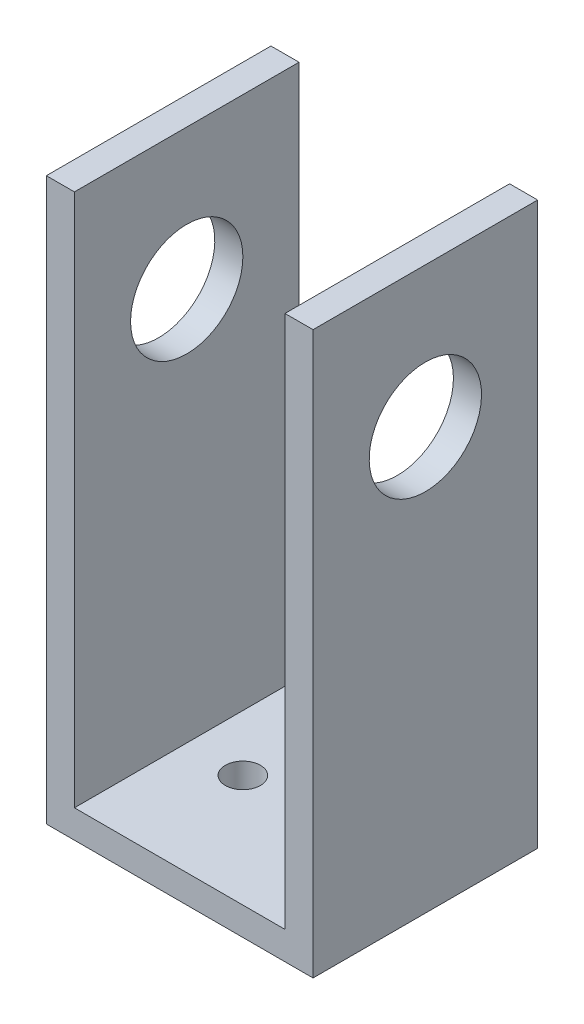
ISO-10303-21;
HEADER;
FILE_DESCRIPTION(('STEP AP214'),'2;1');
FILE_NAME('part.step','',(''),(''),'','','');
FILE_SCHEMA(('AUTOMOTIVE_DESIGN { 1 0 10303 214 1 1 1 1 }'));
ENDSEC;
DATA;
#1=APPLICATION_CONTEXT('core data for automotive mechanical design processes');
#2=APPLICATION_PROTOCOL_DEFINITION('international standard','automotive_design',2000,#1);
#3=PRODUCT_CONTEXT('',#1,'mechanical');
#4=PRODUCT('Part','Part','',(#3));
#5=PRODUCT_RELATED_PRODUCT_CATEGORY('part','',(#4));
#6=PRODUCT_DEFINITION_FORMATION('','',#4);
#7=PRODUCT_DEFINITION_CONTEXT('part definition',#1,'design');
#8=PRODUCT_DEFINITION('design','',#6,#7);
#9=PRODUCT_DEFINITION_SHAPE('','',#8);
#10=(LENGTH_UNIT() NAMED_UNIT(*) SI_UNIT(.MILLI.,.METRE.));
#11=(NAMED_UNIT(*) PLANE_ANGLE_UNIT() SI_UNIT($,.RADIAN.));
#12=(NAMED_UNIT(*) SI_UNIT($,.STERADIAN.) SOLID_ANGLE_UNIT());
#13=UNCERTAINTY_MEASURE_WITH_UNIT(LENGTH_MEASURE(1.E-05),#10,'distance_accuracy_value','');
#14=(GEOMETRIC_REPRESENTATION_CONTEXT(3) GLOBAL_UNCERTAINTY_ASSIGNED_CONTEXT((#13)) GLOBAL_UNIT_ASSIGNED_CONTEXT((#10,
#11,#12)) REPRESENTATION_CONTEXT('',''));
#15=CARTESIAN_POINT('',(0.,0.,0.));
#16=DIRECTION('',(0.,0.,1.));
#17=DIRECTION('',(1.,0.,0.));
#18=AXIS2_PLACEMENT_3D('',#15,#16,#17);
#19=CARTESIAN_POINT('',(0.,40.,40.));
#20=DIRECTION('',(1.,0.,0.));
#21=DIRECTION('',(0.,1.,0.));
#22=AXIS2_PLACEMENT_3D('',#19,#20,#21);
#23=PLANE('',#22);
#24=CARTESIAN_POINT('',(0.,30.,32.));
#25=DIRECTION('',(1.,0.,0.));
#26=DIRECTION('',(0.,1.,0.));
#27=AXIS2_PLACEMENT_3D('',#24,#25,#26);
#28=CIRCLE('',#27,4.);
#29=CARTESIAN_POINT('',(0.,34.,32.));
#30=VERTEX_POINT('',#29);
#31=EDGE_CURVE('E129',#30,#30,#28,.T.);
#32=ORIENTED_EDGE('',*,*,#31,.T.);
#33=EDGE_LOOP('',(#32));
#34=FACE_BOUND('',#33,.T.);
#35=DIRECTION('',(0.,0.,-1.));
#36=VECTOR('',#35,1.);
#37=CARTESIAN_POINT('',(0.,40.,40.));
#38=LINE('',#37,#36);
#39=CARTESIAN_POINT('',(0.,40.,40.));
#40=VERTEX_POINT('',#39);
#41=CARTESIAN_POINT('',(0.,40.,24.));
#42=VERTEX_POINT('',#41);
#43=EDGE_CURVE('E175',#40,#42,#38,.T.);
#44=ORIENTED_EDGE('',*,*,#43,.T.);
#45=DIRECTION('',(0.,1.,0.));
#46=VECTOR('',#45,1.);
#47=CARTESIAN_POINT('',(0.,40.,24.));
#48=LINE('',#47,#46);
#49=CARTESIAN_POINT('',(0.,0.,24.));
#50=VERTEX_POINT('',#49);
#51=EDGE_CURVE('E51',#50,#42,#48,.T.);
#52=ORIENTED_EDGE('',*,*,#51,.F.);
#53=DIRECTION('',(0.,0.,-1.));
#54=VECTOR('',#53,1.);
#55=CARTESIAN_POINT('',(0.,0.,40.));
#56=LINE('',#55,#54);
#57=CARTESIAN_POINT('',(0.,0.,40.));
#58=VERTEX_POINT('',#57);
#59=EDGE_CURVE('E11',#58,#50,#56,.T.);
#60=ORIENTED_EDGE('',*,*,#59,.F.);
#61=DIRECTION('',(0.,-1.,0.));
#62=VECTOR('',#61,1.);
#63=CARTESIAN_POINT('',(0.,40.,40.));
#64=LINE('',#63,#62);
#65=EDGE_CURVE('E161',#40,#58,#64,.T.);
#66=ORIENTED_EDGE('',*,*,#65,.F.);
#67=EDGE_LOOP('',(#44,#52,#60,#66));
#68=FACE_BOUND('',#67,.T.);
#69=ADVANCED_FACE('F35',(#34,#68),#23,.F.);
#70=CARTESIAN_POINT('',(19.,0.,40.));
#71=DIRECTION('',(0.,1.,0.));
#72=DIRECTION('',(-1.,0.,0.));
#73=AXIS2_PLACEMENT_3D('',#70,#71,#72);
#74=PLANE('',#73);
#75=CARTESIAN_POINT('',(6.,0.,32.));
#76=DIRECTION('',(0.,-1.,0.));
#77=DIRECTION('',(-1.,0.,0.));
#78=AXIS2_PLACEMENT_3D('',#75,#76,#77);
#79=CIRCLE('',#78,1.25);
#80=CARTESIAN_POINT('',(4.75,0.,32.));
#81=VERTEX_POINT('',#80);
#82=EDGE_CURVE('E141',#81,#81,#79,.T.);
#83=ORIENTED_EDGE('',*,*,#82,.F.);
#84=EDGE_LOOP('',(#83));
#85=FACE_BOUND('',#84,.T.);
#86=CARTESIAN_POINT('',(13.,0.,32.));
#87=DIRECTION('',(0.,-1.,0.));
#88=DIRECTION('',(1.,0.,0.));
#89=AXIS2_PLACEMENT_3D('',#86,#87,#88);
#90=CIRCLE('',#89,1.25);
#91=CARTESIAN_POINT('',(14.25,0.,32.));
#92=VERTEX_POINT('',#91);
#93=EDGE_CURVE('E132',#92,#92,#90,.T.);
#94=ORIENTED_EDGE('',*,*,#93,.F.);
#95=EDGE_LOOP('',(#94));
#96=FACE_BOUND('',#95,.T.);
#97=ORIENTED_EDGE('',*,*,#59,.T.);
#98=DIRECTION('',(-1.,0.,0.));
#99=VECTOR('',#98,1.);
#100=CARTESIAN_POINT('',(19.,0.,24.));
#101=LINE('',#100,#99);
#102=CARTESIAN_POINT('',(19.,0.,24.));
#103=VERTEX_POINT('',#102);
#104=EDGE_CURVE('E103',#103,#50,#101,.T.);
#105=ORIENTED_EDGE('',*,*,#104,.F.);
#106=DIRECTION('',(0.,0.,-1.));
#107=VECTOR('',#106,1.);
#108=CARTESIAN_POINT('',(19.,0.,40.));
#109=LINE('',#108,#107);
#110=CARTESIAN_POINT('',(19.,0.,40.));
#111=VERTEX_POINT('',#110);
#112=EDGE_CURVE('E43',#111,#103,#109,.T.);
#113=ORIENTED_EDGE('',*,*,#112,.F.);
#114=DIRECTION('',(1.,0.,0.));
#115=VECTOR('',#114,1.);
#116=CARTESIAN_POINT('',(0.,0.,40.));
#117=LINE('',#116,#115);
#118=EDGE_CURVE('E163',#58,#111,#117,.T.);
#119=ORIENTED_EDGE('',*,*,#118,.F.);
#120=EDGE_LOOP('',(#97,#105,#113,#119));
#121=FACE_BOUND('',#120,.T.);
#122=ADVANCED_FACE('F113',(#85,#96,#121),#74,.F.);
#123=CARTESIAN_POINT('',(19.,40.,40.));
#124=DIRECTION('',(-1.,0.,0.));
#125=DIRECTION('',(0.,-1.,0.));
#126=AXIS2_PLACEMENT_3D('',#123,#124,#125);
#127=PLANE('',#126);
#128=CARTESIAN_POINT('',(19.,30.,32.));
#129=DIRECTION('',(1.,0.,0.));
#130=DIRECTION('',(0.,1.,0.));
#131=AXIS2_PLACEMENT_3D('',#128,#129,#130);
#132=CIRCLE('',#131,4.);
#133=CARTESIAN_POINT('',(19.,34.,32.));
#134=VERTEX_POINT('',#133);
#135=EDGE_CURVE('E154',#134,#134,#132,.T.);
#136=ORIENTED_EDGE('',*,*,#135,.F.);
#137=EDGE_LOOP('',(#136));
#138=FACE_BOUND('',#137,.T.);
#139=ORIENTED_EDGE('',*,*,#112,.T.);
#140=DIRECTION('',(0.,1.,0.));
#141=VECTOR('',#140,1.);
#142=CARTESIAN_POINT('',(19.,40.,24.));
#143=LINE('',#142,#141);
#144=CARTESIAN_POINT('',(19.,40.,24.));
#145=VERTEX_POINT('',#144);
#146=EDGE_CURVE('E100',#103,#145,#143,.T.);
#147=ORIENTED_EDGE('',*,*,#146,.T.);
#148=DIRECTION('',(0.,0.,-1.));
#149=VECTOR('',#148,1.);
#150=CARTESIAN_POINT('',(19.,40.,40.));
#151=LINE('',#150,#149);
#152=CARTESIAN_POINT('',(19.,40.,40.));
#153=VERTEX_POINT('',#152);
#154=EDGE_CURVE('E120',#153,#145,#151,.T.);
#155=ORIENTED_EDGE('',*,*,#154,.F.);
#156=DIRECTION('',(0.,1.,0.));
#157=VECTOR('',#156,1.);
#158=CARTESIAN_POINT('',(19.,40.,40.));
#159=LINE('',#158,#157);
#160=EDGE_CURVE('E119',#111,#153,#159,.T.);
#161=ORIENTED_EDGE('',*,*,#160,.F.);
#162=EDGE_LOOP('',(#139,#147,#155,#161));
#163=FACE_BOUND('',#162,.T.);
#164=ADVANCED_FACE('F118',(#138,#163),#127,.F.);
#165=CARTESIAN_POINT('',(17.,40.,40.));
#166=DIRECTION('',(0.,-1.,0.));
#167=DIRECTION('',(0.,0.,-1.));
#168=AXIS2_PLACEMENT_3D('',#165,#166,#167);
#169=PLANE('',#168);
#170=ORIENTED_EDGE('',*,*,#154,.T.);
#171=DIRECTION('',(-1.,0.,0.));
#172=VECTOR('',#171,1.);
#173=CARTESIAN_POINT('',(19.,40.,24.));
#174=LINE('',#173,#172);
#175=CARTESIAN_POINT('',(17.,40.,24.));
#176=VERTEX_POINT('',#175);
#177=EDGE_CURVE('E105',#145,#176,#174,.T.);
#178=ORIENTED_EDGE('',*,*,#177,.T.);
#179=DIRECTION('',(0.,0.,-1.));
#180=VECTOR('',#179,1.);
#181=CARTESIAN_POINT('',(17.,40.,40.));
#182=LINE('',#181,#180);
#183=CARTESIAN_POINT('',(17.,40.,40.));
#184=VERTEX_POINT('',#183);
#185=EDGE_CURVE('E122',#184,#176,#182,.T.);
#186=ORIENTED_EDGE('',*,*,#185,.F.);
#187=DIRECTION('',(-1.,0.,0.));
#188=VECTOR('',#187,1.);
#189=CARTESIAN_POINT('',(17.,40.,40.));
#190=LINE('',#189,#188);
#191=EDGE_CURVE('E166',#153,#184,#190,.T.);
#192=ORIENTED_EDGE('',*,*,#191,.F.);
#193=EDGE_LOOP('',(#170,#178,#186,#192));
#194=FACE_BOUND('',#193,.T.);
#195=ADVANCED_FACE('F194',(#194),#169,.F.);
#196=CARTESIAN_POINT('',(17.,2.,40.));
#197=DIRECTION('',(1.,0.,0.));
#198=DIRECTION('',(0.,0.,-1.));
#199=AXIS2_PLACEMENT_3D('',#196,#197,#198);
#200=PLANE('',#199);
#201=CARTESIAN_POINT('',(17.,30.,32.));
#202=DIRECTION('',(1.,0.,0.));
#203=DIRECTION('',(0.,0.,-1.));
#204=AXIS2_PLACEMENT_3D('',#201,#202,#203);
#205=CIRCLE('',#204,4.);
#206=CARTESIAN_POINT('',(17.,30.,28.));
#207=VERTEX_POINT('',#206);
#208=EDGE_CURVE('E128',#207,#207,#205,.T.);
#209=ORIENTED_EDGE('',*,*,#208,.T.);
#210=EDGE_LOOP('',(#209));
#211=FACE_BOUND('',#210,.T.);
#212=ORIENTED_EDGE('',*,*,#185,.T.);
#213=DIRECTION('',(0.,-1.,0.));
#214=VECTOR('',#213,1.);
#215=CARTESIAN_POINT('',(17.,2.,24.));
#216=LINE('',#215,#214);
#217=CARTESIAN_POINT('',(17.,2.,24.));
#218=VERTEX_POINT('',#217);
#219=EDGE_CURVE('E151',#176,#218,#216,.T.);
#220=ORIENTED_EDGE('',*,*,#219,.T.);
#221=DIRECTION('',(0.,0.,-1.));
#222=VECTOR('',#221,1.);
#223=CARTESIAN_POINT('',(17.,2.,40.));
#224=LINE('',#223,#222);
#225=CARTESIAN_POINT('',(17.,2.,40.));
#226=VERTEX_POINT('',#225);
#227=EDGE_CURVE('E184',#226,#218,#224,.T.);
#228=ORIENTED_EDGE('',*,*,#227,.F.);
#229=DIRECTION('',(0.,-1.,0.));
#230=VECTOR('',#229,1.);
#231=CARTESIAN_POINT('',(17.,2.,40.));
#232=LINE('',#231,#230);
#233=EDGE_CURVE('E168',#184,#226,#232,.T.);
#234=ORIENTED_EDGE('',*,*,#233,.F.);
#235=EDGE_LOOP('',(#212,#220,#228,#234));
#236=FACE_BOUND('',#235,.T.);
#237=ADVANCED_FACE('F190',(#211,#236),#200,.F.);
#238=CARTESIAN_POINT('',(2.,2.,40.));
#239=DIRECTION('',(0.,-1.,0.));
#240=DIRECTION('',(0.,0.,-1.));
#241=AXIS2_PLACEMENT_3D('',#238,#239,#240);
#242=PLANE('',#241);
#243=CARTESIAN_POINT('',(6.,2.,32.));
#244=DIRECTION('',(0.,-1.,0.));
#245=DIRECTION('',(0.,0.,-1.));
#246=AXIS2_PLACEMENT_3D('',#243,#244,#245);
#247=CIRCLE('',#246,1.25);
#248=CARTESIAN_POINT('',(6.,2.,30.75));
#249=VERTEX_POINT('',#248);
#250=EDGE_CURVE('E38',#249,#249,#247,.T.);
#251=ORIENTED_EDGE('',*,*,#250,.T.);
#252=EDGE_LOOP('',(#251));
#253=FACE_BOUND('',#252,.T.);
#254=CARTESIAN_POINT('',(13.,2.,32.));
#255=DIRECTION('',(0.,-1.,0.));
#256=DIRECTION('',(0.,0.,-1.));
#257=AXIS2_PLACEMENT_3D('',#254,#255,#256);
#258=CIRCLE('',#257,1.25);
#259=CARTESIAN_POINT('',(13.,2.,30.75));
#260=VERTEX_POINT('',#259);
#261=EDGE_CURVE('E130',#260,#260,#258,.T.);
#262=ORIENTED_EDGE('',*,*,#261,.T.);
#263=EDGE_LOOP('',(#262));
#264=FACE_BOUND('',#263,.T.);
#265=ORIENTED_EDGE('',*,*,#227,.T.);
#266=DIRECTION('',(-1.,0.,0.));
#267=VECTOR('',#266,1.);
#268=CARTESIAN_POINT('',(2.,2.,24.));
#269=LINE('',#268,#267);
#270=CARTESIAN_POINT('',(2.,2.,24.));
#271=VERTEX_POINT('',#270);
#272=EDGE_CURVE('E148',#218,#271,#269,.T.);
#273=ORIENTED_EDGE('',*,*,#272,.T.);
#274=DIRECTION('',(0.,0.,-1.));
#275=VECTOR('',#274,1.);
#276=CARTESIAN_POINT('',(2.,2.,40.));
#277=LINE('',#276,#275);
#278=CARTESIAN_POINT('',(2.,2.,40.));
#279=VERTEX_POINT('',#278);
#280=EDGE_CURVE('E181',#279,#271,#277,.T.);
#281=ORIENTED_EDGE('',*,*,#280,.F.);
#282=DIRECTION('',(-1.,0.,0.));
#283=VECTOR('',#282,1.);
#284=CARTESIAN_POINT('',(2.,2.,40.));
#285=LINE('',#284,#283);
#286=EDGE_CURVE('E170',#226,#279,#285,.T.);
#287=ORIENTED_EDGE('',*,*,#286,.F.);
#288=EDGE_LOOP('',(#265,#273,#281,#287));
#289=FACE_BOUND('',#288,.T.);
#290=ADVANCED_FACE('F207',(#253,#264,#289),#242,.F.);
#291=CARTESIAN_POINT('',(2.,2.,40.));
#292=DIRECTION('',(-1.,0.,0.));
#293=DIRECTION('',(0.,-1.,0.));
#294=AXIS2_PLACEMENT_3D('',#291,#292,#293);
#295=PLANE('',#294);
#296=CARTESIAN_POINT('',(2.,30.,32.));
#297=DIRECTION('',(-1.,0.,0.));
#298=DIRECTION('',(0.,-1.,0.));
#299=AXIS2_PLACEMENT_3D('',#296,#297,#298);
#300=CIRCLE('',#299,4.);
#301=CARTESIAN_POINT('',(2.,26.,32.));
#302=VERTEX_POINT('',#301);
#303=EDGE_CURVE('E126',#302,#302,#300,.T.);
#304=ORIENTED_EDGE('',*,*,#303,.T.);
#305=EDGE_LOOP('',(#304));
#306=FACE_BOUND('',#305,.T.);
#307=ORIENTED_EDGE('',*,*,#280,.T.);
#308=DIRECTION('',(0.,1.,0.));
#309=VECTOR('',#308,1.);
#310=CARTESIAN_POINT('',(2.,2.,24.));
#311=LINE('',#310,#309);
#312=CARTESIAN_POINT('',(2.00000000000001,40.,24.));
#313=VERTEX_POINT('',#312);
#314=EDGE_CURVE('E144',#271,#313,#311,.T.);
#315=ORIENTED_EDGE('',*,*,#314,.T.);
#316=DIRECTION('',(0.,0.,-1.));
#317=VECTOR('',#316,1.);
#318=CARTESIAN_POINT('',(2.,40.,40.));
#319=LINE('',#318,#317);
#320=CARTESIAN_POINT('',(2.,40.,40.));
#321=VERTEX_POINT('',#320);
#322=EDGE_CURVE('E178',#321,#313,#319,.T.);
#323=ORIENTED_EDGE('',*,*,#322,.F.);
#324=DIRECTION('',(0.,1.,0.));
#325=VECTOR('',#324,1.);
#326=CARTESIAN_POINT('',(2.,2.,40.));
#327=LINE('',#326,#325);
#328=EDGE_CURVE('E172',#279,#321,#327,.T.);
#329=ORIENTED_EDGE('',*,*,#328,.F.);
#330=EDGE_LOOP('',(#307,#315,#323,#329));
#331=FACE_BOUND('',#330,.T.);
#332=ADVANCED_FACE('F202',(#306,#331),#295,.F.);
#333=CARTESIAN_POINT('',(2.,40.,40.));
#334=DIRECTION('',(0.,-1.,0.));
#335=DIRECTION('',(0.,0.,-1.));
#336=AXIS2_PLACEMENT_3D('',#333,#334,#335);
#337=PLANE('',#336);
#338=ORIENTED_EDGE('',*,*,#322,.T.);
#339=EDGE_CURVE('E116',#313,#42,#174,.T.);
#340=ORIENTED_EDGE('',*,*,#339,.T.);
#341=ORIENTED_EDGE('',*,*,#43,.F.);
#342=DIRECTION('',(-1.,0.,0.));
#343=VECTOR('',#342,1.);
#344=CARTESIAN_POINT('',(2.,40.,40.));
#345=LINE('',#344,#343);
#346=EDGE_CURVE('E59',#321,#40,#345,.T.);
#347=ORIENTED_EDGE('',*,*,#346,.F.);
#348=EDGE_LOOP('',(#338,#340,#341,#347));
#349=FACE_BOUND('',#348,.T.);
#350=ADVANCED_FACE('F199',(#349),#337,.F.);
#351=CARTESIAN_POINT('',(0.,0.,40.));
#352=DIRECTION('',(0.,0.,1.));
#353=DIRECTION('',(1.,0.,0.));
#354=AXIS2_PLACEMENT_3D('',#351,#352,#353);
#355=PLANE('',#354);
#356=ORIENTED_EDGE('',*,*,#65,.T.);
#357=ORIENTED_EDGE('',*,*,#118,.T.);
#358=ORIENTED_EDGE('',*,*,#160,.T.);
#359=ORIENTED_EDGE('',*,*,#191,.T.);
#360=ORIENTED_EDGE('',*,*,#233,.T.);
#361=ORIENTED_EDGE('',*,*,#286,.T.);
#362=ORIENTED_EDGE('',*,*,#328,.T.);
#363=ORIENTED_EDGE('',*,*,#346,.T.);
#364=EDGE_LOOP('',(#356,#357,#358,#359,#360,#361,#362,#363));
#365=FACE_BOUND('',#364,.T.);
#366=ADVANCED_FACE('F195',(#365),#355,.T.);
#367=CARTESIAN_POINT('',(0.,30.,32.));
#368=DIRECTION('',(1.,0.,0.));
#369=DIRECTION('',(0.,1.,0.));
#370=AXIS2_PLACEMENT_3D('',#367,#368,#369);
#371=CYLINDRICAL_SURFACE('',#370,4.);
#372=ORIENTED_EDGE('',*,*,#31,.F.);
#373=EDGE_LOOP('',(#372));
#374=FACE_BOUND('',#373,.T.);
#375=ORIENTED_EDGE('',*,*,#303,.F.);
#376=EDGE_LOOP('',(#375));
#377=FACE_BOUND('',#376,.T.);
#378=ADVANCED_FACE('F227',(#374,#377),#371,.F.);
#379=ORIENTED_EDGE('',*,*,#135,.T.);
#380=EDGE_LOOP('',(#379));
#381=FACE_BOUND('',#380,.T.);
#382=ORIENTED_EDGE('',*,*,#208,.F.);
#383=EDGE_LOOP('',(#382));
#384=FACE_BOUND('',#383,.T.);
#385=ADVANCED_FACE('F230',(#381,#384),#371,.F.);
#386=CARTESIAN_POINT('',(19.,40.,24.));
#387=DIRECTION('',(0.,0.,1.));
#388=DIRECTION('',(0.,-1.,0.));
#389=AXIS2_PLACEMENT_3D('',#386,#387,#388);
#390=PLANE('',#389);
#391=ORIENTED_EDGE('',*,*,#177,.F.);
#392=ORIENTED_EDGE('',*,*,#146,.F.);
#393=ORIENTED_EDGE('',*,*,#104,.T.);
#394=ORIENTED_EDGE('',*,*,#51,.T.);
#395=ORIENTED_EDGE('',*,*,#339,.F.);
#396=ORIENTED_EDGE('',*,*,#314,.F.);
#397=ORIENTED_EDGE('',*,*,#272,.F.);
#398=ORIENTED_EDGE('',*,*,#219,.F.);
#399=EDGE_LOOP('',(#391,#392,#393,#394,#395,#396,#397,#398));
#400=FACE_BOUND('',#399,.T.);
#401=ADVANCED_FACE('F102',(#400),#390,.F.);
#402=CARTESIAN_POINT('',(13.,40.,32.));
#403=DIRECTION('',(0.,-1.,0.));
#404=DIRECTION('',(1.,0.,0.));
#405=AXIS2_PLACEMENT_3D('',#402,#403,#404);
#406=CYLINDRICAL_SURFACE('',#405,1.25);
#407=ORIENTED_EDGE('',*,*,#93,.T.);
#408=EDGE_LOOP('',(#407));
#409=FACE_BOUND('',#408,.T.);
#410=ORIENTED_EDGE('',*,*,#261,.F.);
#411=EDGE_LOOP('',(#410));
#412=FACE_BOUND('',#411,.T.);
#413=ADVANCED_FACE('F310',(#409,#412),#406,.F.);
#414=CARTESIAN_POINT('',(6.,40.,32.));
#415=DIRECTION('',(0.,-1.,0.));
#416=DIRECTION('',(1.,0.,0.));
#417=AXIS2_PLACEMENT_3D('',#414,#415,#416);
#418=CYLINDRICAL_SURFACE('',#417,1.25);
#419=ORIENTED_EDGE('',*,*,#82,.T.);
#420=EDGE_LOOP('',(#419));
#421=FACE_BOUND('',#420,.T.);
#422=ORIENTED_EDGE('',*,*,#250,.F.);
#423=EDGE_LOOP('',(#422));
#424=FACE_BOUND('',#423,.T.);
#425=ADVANCED_FACE('F315',(#421,#424),#418,.F.);
#426=CLOSED_SHELL('',(#69,#122,#164,#195,#237,#290,#332,#350,#366,#378,#385,#401,#413,#425));
#427=MANIFOLD_SOLID_BREP('B2',#426);
#428=ADVANCED_BREP_SHAPE_REPRESENTATION('',(#18,#427),#14);
#429=SHAPE_DEFINITION_REPRESENTATION(#9,#428);
ENDSEC;
END-ISO-10303-21;
